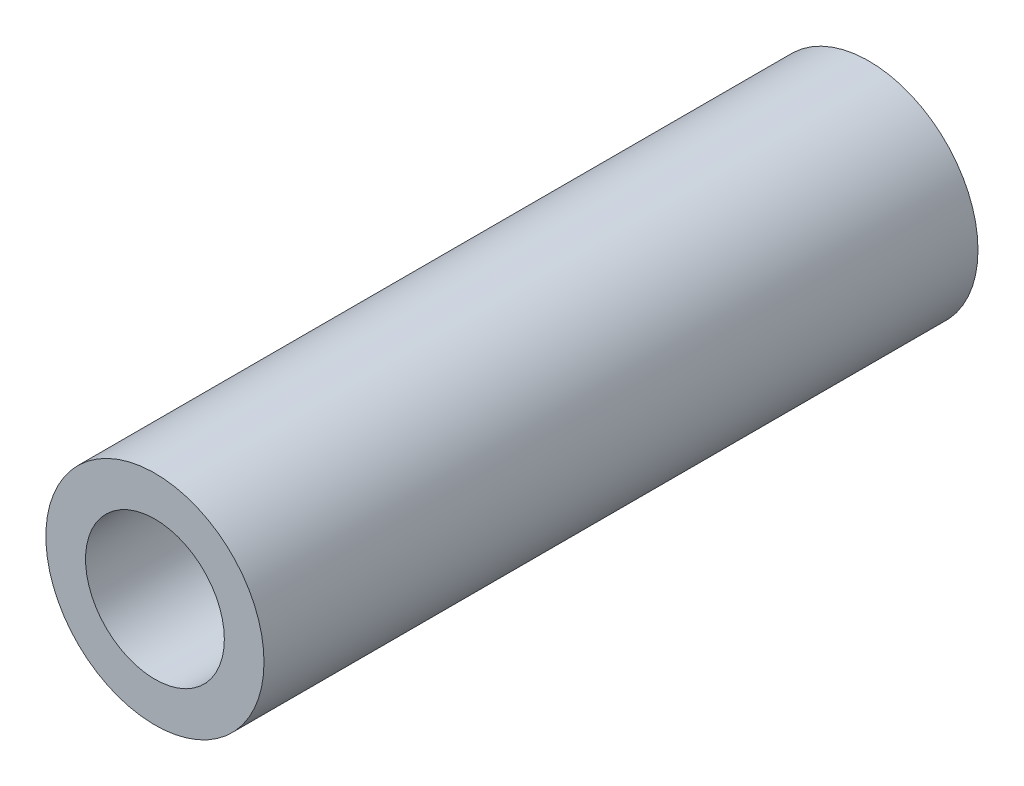
ISO-10303-21;
HEADER;
FILE_DESCRIPTION(('STEP AP214'),'2;1');
FILE_NAME('part.step','',(''),(''),'','','');
FILE_SCHEMA(('AUTOMOTIVE_DESIGN { 1 0 10303 214 1 1 1 1 }'));
ENDSEC;
DATA;
#1=APPLICATION_CONTEXT('core data for automotive mechanical design processes');
#2=APPLICATION_PROTOCOL_DEFINITION('international standard','automotive_design',2000,#1);
#3=PRODUCT_CONTEXT('',#1,'mechanical');
#4=PRODUCT('Part','Part','',(#3));
#5=PRODUCT_RELATED_PRODUCT_CATEGORY('part','',(#4));
#6=PRODUCT_DEFINITION_FORMATION('','',#4);
#7=PRODUCT_DEFINITION_CONTEXT('part definition',#1,'design');
#8=PRODUCT_DEFINITION('design','',#6,#7);
#9=PRODUCT_DEFINITION_SHAPE('','',#8);
#10=(LENGTH_UNIT() NAMED_UNIT(*) SI_UNIT(.MILLI.,.METRE.));
#11=(NAMED_UNIT(*) PLANE_ANGLE_UNIT() SI_UNIT($,.RADIAN.));
#12=(NAMED_UNIT(*) SI_UNIT($,.STERADIAN.) SOLID_ANGLE_UNIT());
#13=UNCERTAINTY_MEASURE_WITH_UNIT(LENGTH_MEASURE(1.E-05),#10,'distance_accuracy_value','');
#14=(GEOMETRIC_REPRESENTATION_CONTEXT(3) GLOBAL_UNCERTAINTY_ASSIGNED_CONTEXT((#13)) GLOBAL_UNIT_ASSIGNED_CONTEXT((#10,
#11,#12)) REPRESENTATION_CONTEXT('',''));
#15=CARTESIAN_POINT('',(0.,0.,0.));
#16=DIRECTION('',(0.,0.,1.));
#17=DIRECTION('',(1.,0.,0.));
#18=AXIS2_PLACEMENT_3D('',#15,#16,#17);
#19=CARTESIAN_POINT('',(0.,0.,18.));
#20=DIRECTION('',(0.,0.,1.));
#21=DIRECTION('',(1.,0.,0.));
#22=AXIS2_PLACEMENT_3D('',#19,#20,#21);
#23=PLANE('',#22);
#24=CARTESIAN_POINT('',(0.,0.,18.));
#25=DIRECTION('',(0.,0.,1.));
#26=DIRECTION('',(1.,0.,0.));
#27=AXIS2_PLACEMENT_3D('',#24,#25,#26);
#28=CIRCLE('',#27,2.75);
#29=CARTESIAN_POINT('',(2.75,0.,18.));
#30=VERTEX_POINT('',#29);
#31=EDGE_CURVE('E10',#30,#30,#28,.T.);
#32=ORIENTED_EDGE('',*,*,#31,.T.);
#33=EDGE_LOOP('',(#32));
#34=FACE_BOUND('',#33,.T.);
#35=CARTESIAN_POINT('',(0.,0.,18.));
#36=DIRECTION('',(0.,0.,1.));
#37=DIRECTION('',(1.,0.,0.));
#38=AXIS2_PLACEMENT_3D('',#35,#36,#37);
#39=CIRCLE('',#38,1.75);
#40=CARTESIAN_POINT('',(1.75,0.,18.));
#41=VERTEX_POINT('',#40);
#42=EDGE_CURVE('E56',#41,#41,#39,.T.);
#43=ORIENTED_EDGE('',*,*,#42,.F.);
#44=EDGE_LOOP('',(#43));
#45=FACE_BOUND('',#44,.T.);
#46=ADVANCED_FACE('F43',(#34,#45),#23,.T.);
#47=CARTESIAN_POINT('',(0.,0.,0.));
#48=DIRECTION('',(0.,0.,1.));
#49=DIRECTION('',(1.,0.,0.));
#50=AXIS2_PLACEMENT_3D('',#47,#48,#49);
#51=PLANE('',#50);
#52=CARTESIAN_POINT('',(0.,0.,0.));
#53=DIRECTION('',(0.,0.,1.));
#54=DIRECTION('',(1.,0.,0.));
#55=AXIS2_PLACEMENT_3D('',#52,#53,#54);
#56=CIRCLE('',#55,2.75);
#57=CARTESIAN_POINT('',(2.75,0.,0.));
#58=VERTEX_POINT('',#57);
#59=EDGE_CURVE('E47',#58,#58,#56,.T.);
#60=ORIENTED_EDGE('',*,*,#59,.F.);
#61=EDGE_LOOP('',(#60));
#62=FACE_BOUND('',#61,.T.);
#63=CARTESIAN_POINT('',(0.,0.,0.));
#64=DIRECTION('',(0.,0.,1.));
#65=DIRECTION('',(1.,0.,0.));
#66=AXIS2_PLACEMENT_3D('',#63,#64,#65);
#67=CIRCLE('',#66,1.75);
#68=CARTESIAN_POINT('',(1.75,0.,0.));
#69=VERTEX_POINT('',#68);
#70=EDGE_CURVE('E58',#69,#69,#67,.T.);
#71=ORIENTED_EDGE('',*,*,#70,.T.);
#72=EDGE_LOOP('',(#71));
#73=FACE_BOUND('',#72,.T.);
#74=ADVANCED_FACE('F70',(#62,#73),#51,.F.);
#75=CARTESIAN_POINT('',(0.,0.,18.));
#76=DIRECTION('',(0.,0.,-1.));
#77=DIRECTION('',(-1.,0.,0.));
#78=AXIS2_PLACEMENT_3D('',#75,#76,#77);
#79=CYLINDRICAL_SURFACE('',#78,2.75);
#80=ORIENTED_EDGE('',*,*,#31,.F.);
#81=EDGE_LOOP('',(#80));
#82=FACE_BOUND('',#81,.T.);
#83=ORIENTED_EDGE('',*,*,#59,.T.);
#84=EDGE_LOOP('',(#83));
#85=FACE_BOUND('',#84,.T.);
#86=ADVANCED_FACE('F45',(#82,#85),#79,.T.);
#87=CARTESIAN_POINT('',(0.,0.,18.));
#88=DIRECTION('',(0.,0.,-1.));
#89=DIRECTION('',(-1.,0.,0.));
#90=AXIS2_PLACEMENT_3D('',#87,#88,#89);
#91=CYLINDRICAL_SURFACE('',#90,1.75);
#92=ORIENTED_EDGE('',*,*,#42,.T.);
#93=EDGE_LOOP('',(#92));
#94=FACE_BOUND('',#93,.T.);
#95=ORIENTED_EDGE('',*,*,#70,.F.);
#96=EDGE_LOOP('',(#95));
#97=FACE_BOUND('',#96,.T.);
#98=ADVANCED_FACE('F66',(#94,#97),#91,.F.);
#99=CLOSED_SHELL('',(#46,#74,#86,#98));
#100=MANIFOLD_SOLID_BREP('B2',#99);
#101=ADVANCED_BREP_SHAPE_REPRESENTATION('',(#18,#100),#14);
#102=SHAPE_DEFINITION_REPRESENTATION(#9,#101);
ENDSEC;
END-ISO-10303-21;
